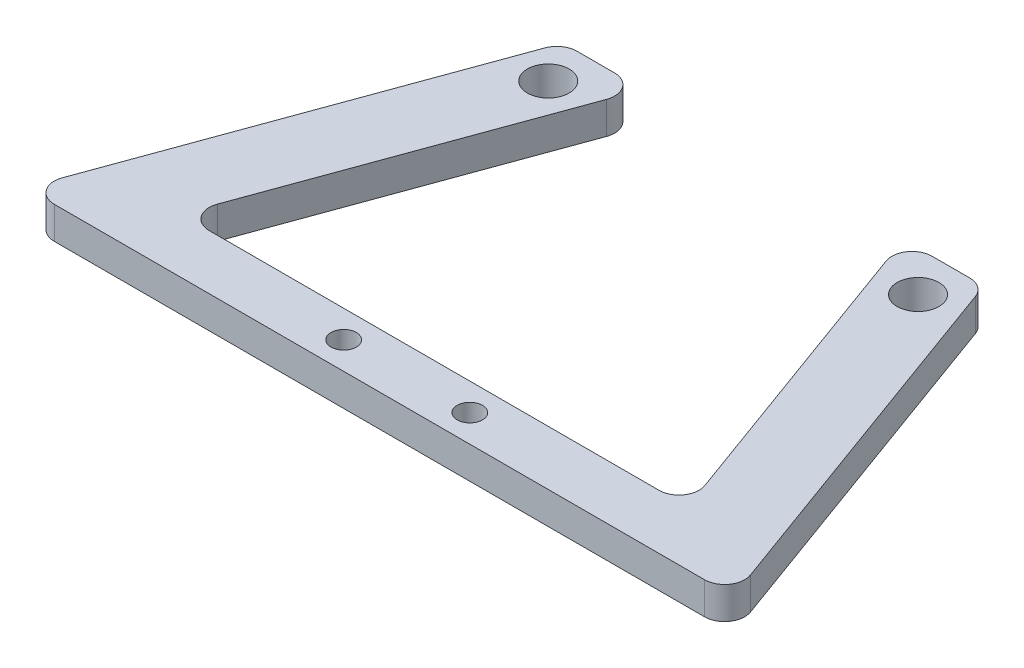
ISO-10303-21;
HEADER;
FILE_DESCRIPTION(('STEP AP214'),'2;1');
FILE_NAME('part.step','',(''),(''),'','','');
FILE_SCHEMA(('AUTOMOTIVE_DESIGN { 1 0 10303 214 1 1 1 1 }'));
ENDSEC;
DATA;
#1=APPLICATION_CONTEXT('core data for automotive mechanical design processes');
#2=APPLICATION_PROTOCOL_DEFINITION('international standard','automotive_design',2000,#1);
#3=PRODUCT_CONTEXT('',#1,'mechanical');
#4=PRODUCT('Part','Part','',(#3));
#5=PRODUCT_RELATED_PRODUCT_CATEGORY('part','',(#4));
#6=PRODUCT_DEFINITION_FORMATION('','',#4);
#7=PRODUCT_DEFINITION_CONTEXT('part definition',#1,'design');
#8=PRODUCT_DEFINITION('design','',#6,#7);
#9=PRODUCT_DEFINITION_SHAPE('','',#8);
#10=(LENGTH_UNIT() NAMED_UNIT(*) SI_UNIT(.MILLI.,.METRE.));
#11=(NAMED_UNIT(*) PLANE_ANGLE_UNIT() SI_UNIT($,.RADIAN.));
#12=(NAMED_UNIT(*) SI_UNIT($,.STERADIAN.) SOLID_ANGLE_UNIT());
#13=UNCERTAINTY_MEASURE_WITH_UNIT(LENGTH_MEASURE(1.E-05),#10,'distance_accuracy_value','');
#14=(GEOMETRIC_REPRESENTATION_CONTEXT(3) GLOBAL_UNCERTAINTY_ASSIGNED_CONTEXT((#13)) GLOBAL_UNIT_ASSIGNED_CONTEXT((#10,
#11,#12)) REPRESENTATION_CONTEXT('',''));
#15=CARTESIAN_POINT('',(0.,0.,0.));
#16=DIRECTION('',(0.,0.,1.));
#17=DIRECTION('',(1.,0.,0.));
#18=AXIS2_PLACEMENT_3D('',#15,#16,#17);
#19=CARTESIAN_POINT('',(42.3065378908995,2.54,29.5275));
#20=DIRECTION('',(0.,-1.,0.));
#21=DIRECTION('',(0.,0.,-1.));
#22=AXIS2_PLACEMENT_3D('',#19,#20,#21);
#23=PLANE('',#22);
#24=CARTESIAN_POINT('',(42.3065378908995,2.54,29.5275));
#25=DIRECTION('',(0.,1.,0.));
#26=DIRECTION('',(0.,0.,-1.));
#27=AXIS2_PLACEMENT_3D('',#24,#25,#26);
#28=CIRCLE('',#27,1.58749999999999);
#29=CARTESIAN_POINT('',(42.3065378908995,2.54,31.115));
#30=VERTEX_POINT('',#29);
#31=CARTESIAN_POINT('',(43.7982999263971,2.54,28.9845430224705));
#32=VERTEX_POINT('',#31);
#33=EDGE_CURVE('E215',#30,#32,#28,.T.);
#34=ORIENTED_EDGE('',*,*,#33,.T.);
#35=DIRECTION('',(-0.342020143325672,0.,-0.939692620785907));
#36=VECTOR('',#35,1.);
#37=CARTESIAN_POINT('',(33.6289715809993,2.54,1.04454302247049));
#38=LINE('',#37,#36);
#39=CARTESIAN_POINT('',(33.6289715809993,2.54,1.04454302247049));
#40=VERTEX_POINT('',#39);
#41=EDGE_CURVE('E123',#32,#40,#38,.T.);
#42=ORIENTED_EDGE('',*,*,#41,.T.);
#43=CARTESIAN_POINT('',(32.1372095455017,2.54,1.5875));
#44=DIRECTION('',(0.,1.,0.));
#45=DIRECTION('',(0.,0.,1.));
#46=AXIS2_PLACEMENT_3D('',#43,#44,#45);
#47=CIRCLE('',#46,1.5875);
#48=CARTESIAN_POINT('',(32.1372095455017,2.54,0.));
#49=VERTEX_POINT('',#48);
#50=EDGE_CURVE('E254',#40,#49,#47,.T.);
#51=ORIENTED_EDGE('',*,*,#50,.T.);
#52=DIRECTION('',(-1.,0.,0.));
#53=VECTOR('',#52,1.);
#54=CARTESIAN_POINT('',(29.1659739731127,2.54,0.));
#55=LINE('',#54,#53);
#56=CARTESIAN_POINT('',(29.1659739731127,2.54,0.));
#57=VERTEX_POINT('',#56);
#58=EDGE_CURVE('E273',#49,#57,#55,.T.);
#59=ORIENTED_EDGE('',*,*,#58,.T.);
#60=CARTESIAN_POINT('',(29.1659739731127,2.54,1.5875));
#61=DIRECTION('',(0.,1.,0.));
#62=DIRECTION('',(0.,0.,1.));
#63=AXIS2_PLACEMENT_3D('',#60,#61,#62);
#64=CIRCLE('',#63,1.5875);
#65=CARTESIAN_POINT('',(27.6742119376151,2.54,2.13045697752951));
#66=VERTEX_POINT('',#65);
#67=EDGE_CURVE('E270',#57,#66,#64,.T.);
#68=ORIENTED_EDGE('',*,*,#67,.T.);
#69=DIRECTION('',(0.342020143325672,0.,0.939692620785907));
#70=VECTOR('',#69,1.);
#71=CARTESIAN_POINT('',(35.8766764548356,2.54,24.6665430224705));
#72=LINE('',#71,#70);
#73=CARTESIAN_POINT('',(35.8766764548356,2.54,24.6665430224705));
#74=VERTEX_POINT('',#73);
#75=EDGE_CURVE('E272',#66,#74,#72,.T.);
#76=ORIENTED_EDGE('',*,*,#75,.T.);
#77=CARTESIAN_POINT('',(34.384914419338,2.54,25.2095));
#78=DIRECTION('',(0.,-1.,0.));
#79=DIRECTION('',(0.,0.,-1.));
#80=AXIS2_PLACEMENT_3D('',#77,#78,#79);
#81=CIRCLE('',#80,1.5875);
#82=CARTESIAN_POINT('',(34.384914419338,2.54,26.797));
#83=VERTEX_POINT('',#82);
#84=EDGE_CURVE('E275',#74,#83,#81,.T.);
#85=ORIENTED_EDGE('',*,*,#84,.T.);
#86=DIRECTION('',(-1.,0.,0.));
#87=VECTOR('',#86,1.);
#88=CARTESIAN_POINT('',(34.384914419338,2.54,26.797));
#89=LINE('',#88,#87);
#90=CARTESIAN_POINT('',(-1.13612540692842,2.54,26.797));
#91=VERTEX_POINT('',#90);
#92=EDGE_CURVE('E281',#83,#91,#89,.T.);
#93=ORIENTED_EDGE('',*,*,#92,.T.);
#94=CARTESIAN_POINT('',(-1.13612540692842,2.54,25.2095));
#95=DIRECTION('',(0.,-1.,0.));
#96=DIRECTION('',(0.,0.,-1.));
#97=AXIS2_PLACEMENT_3D('',#94,#95,#96);
#98=CIRCLE('',#97,1.5875);
#99=CARTESIAN_POINT('',(-2.62788744242605,2.54,24.6665430224705));
#100=VERTEX_POINT('',#99);
#101=EDGE_CURVE('E283',#91,#100,#98,.T.);
#102=ORIENTED_EDGE('',*,*,#101,.T.);
#103=DIRECTION('',(0.342020143325672,0.,-0.939692620785907));
#104=VECTOR('',#103,1.);
#105=CARTESIAN_POINT('',(-2.62788744242605,2.54,24.6665430224705));
#106=LINE('',#105,#104);
#107=CARTESIAN_POINT('',(5.5745770747945,2.54,2.13045697752952));
#108=VERTEX_POINT('',#107);
#109=EDGE_CURVE('E285',#100,#108,#106,.T.);
#110=ORIENTED_EDGE('',*,*,#109,.T.);
#111=CARTESIAN_POINT('',(4.08281503929688,2.54,1.5875));
#112=DIRECTION('',(0.,1.,0.));
#113=DIRECTION('',(0.,0.,1.));
#114=AXIS2_PLACEMENT_3D('',#111,#112,#113);
#115=CIRCLE('',#114,1.5875);
#116=CARTESIAN_POINT('',(4.08281503929687,2.54,0.));
#117=VERTEX_POINT('',#116);
#118=EDGE_CURVE('E287',#108,#117,#115,.T.);
#119=ORIENTED_EDGE('',*,*,#118,.T.);
#120=DIRECTION('',(-1.,0.,0.));
#121=VECTOR('',#120,1.);
#122=CARTESIAN_POINT('',(4.08281503929687,2.54,0.));
#123=LINE('',#122,#121);
#124=CARTESIAN_POINT('',(1.11157946690792,2.54,0.));
#125=VERTEX_POINT('',#124);
#126=EDGE_CURVE('E289',#117,#125,#123,.T.);
#127=ORIENTED_EDGE('',*,*,#126,.T.);
#128=CARTESIAN_POINT('',(1.11157946690791,2.54,1.5875));
#129=DIRECTION('',(0.,1.,0.));
#130=DIRECTION('',(0.,0.,-1.));
#131=AXIS2_PLACEMENT_3D('',#128,#129,#130);
#132=CIRCLE('',#131,1.5875);
#133=CARTESIAN_POINT('',(-0.38018256858972,2.54,1.0445430224705));
#134=VERTEX_POINT('',#133);
#135=EDGE_CURVE('E166',#125,#134,#132,.T.);
#136=ORIENTED_EDGE('',*,*,#135,.T.);
#137=DIRECTION('',(-0.342020143325672,0.,0.939692620785907));
#138=VECTOR('',#137,1.);
#139=CARTESIAN_POINT('',(-0.380182568589721,2.54,1.0445430224705));
#140=LINE('',#139,#138);
#141=CARTESIAN_POINT('',(-10.5495109139875,2.54,28.9845430224705));
#142=VERTEX_POINT('',#141);
#143=EDGE_CURVE('E160',#134,#142,#140,.T.);
#144=ORIENTED_EDGE('',*,*,#143,.T.);
#145=CARTESIAN_POINT('',(-9.05774887848992,2.54,29.5275));
#146=DIRECTION('',(0.,1.,0.));
#147=DIRECTION('',(0.,0.,1.));
#148=AXIS2_PLACEMENT_3D('',#145,#146,#147);
#149=CIRCLE('',#148,1.58749999999999);
#150=CARTESIAN_POINT('',(-9.05774887848992,2.54,31.115));
#151=VERTEX_POINT('',#150);
#152=EDGE_CURVE('E164',#142,#151,#149,.T.);
#153=ORIENTED_EDGE('',*,*,#152,.T.);
#154=DIRECTION('',(1.,0.,0.));
#155=VECTOR('',#154,1.);
#156=CARTESIAN_POINT('',(-9.05774887848992,2.54,31.115));
#157=LINE('',#156,#155);
#158=EDGE_CURVE('E56',#151,#30,#157,.T.);
#159=ORIENTED_EDGE('',*,*,#158,.T.);
#160=EDGE_LOOP('',(#34,#42,#51,#59,#68,#76,#85,#93,#102,#110,#119,#127,#136,#144,#153,#159));
#161=FACE_BOUND('',#160,.T.);
#162=CARTESIAN_POINT('',(2.01939450620479,2.54,3.175));
#163=DIRECTION('',(0.,1.,0.));
#164=DIRECTION('',(0.,0.,1.));
#165=AXIS2_PLACEMENT_3D('',#162,#163,#164);
#166=CIRCLE('',#165,1.65);
#167=CARTESIAN_POINT('',(2.01939450620479,2.54,4.825));
#168=VERTEX_POINT('',#167);
#169=EDGE_CURVE('E188',#168,#168,#166,.T.);
#170=ORIENTED_EDGE('',*,*,#169,.F.);
#171=EDGE_LOOP('',(#170));
#172=FACE_BOUND('',#171,.T.);
#173=CARTESIAN_POINT('',(11.6426945062048,2.54,28.956));
#174=DIRECTION('',(0.,1.,0.));
#175=DIRECTION('',(0.,0.,1.));
#176=AXIS2_PLACEMENT_3D('',#173,#174,#175);
#177=CIRCLE('',#176,1.);
#178=CARTESIAN_POINT('',(11.6426945062048,2.54,29.956));
#179=VERTEX_POINT('',#178);
#180=EDGE_CURVE('E353',#179,#179,#177,.T.);
#181=ORIENTED_EDGE('',*,*,#180,.F.);
#182=EDGE_LOOP('',(#181));
#183=FACE_BOUND('',#182,.T.);
#184=CARTESIAN_POINT('',(21.6060945062048,2.54,28.956));
#185=DIRECTION('',(0.,1.,0.));
#186=DIRECTION('',(0.,0.,-1.));
#187=AXIS2_PLACEMENT_3D('',#184,#185,#186);
#188=CIRCLE('',#187,1.);
#189=CARTESIAN_POINT('',(21.6060945062048,2.54,27.956));
#190=VERTEX_POINT('',#189);
#191=EDGE_CURVE('E347',#190,#190,#188,.T.);
#192=ORIENTED_EDGE('',*,*,#191,.F.);
#193=EDGE_LOOP('',(#192));
#194=FACE_BOUND('',#193,.T.);
#195=CARTESIAN_POINT('',(31.2293945062048,2.54,3.175));
#196=DIRECTION('',(0.,1.,0.));
#197=DIRECTION('',(0.,0.,-1.));
#198=AXIS2_PLACEMENT_3D('',#195,#196,#197);
#199=CIRCLE('',#198,1.65);
#200=CARTESIAN_POINT('',(31.2293945062048,2.54,1.525));
#201=VERTEX_POINT('',#200);
#202=EDGE_CURVE('E338',#201,#201,#199,.T.);
#203=ORIENTED_EDGE('',*,*,#202,.F.);
#204=EDGE_LOOP('',(#203));
#205=FACE_BOUND('',#204,.T.);
#206=ADVANCED_FACE('F39',(#161,#172,#183,#194,#205),#23,.F.);
#207=CARTESIAN_POINT('',(42.3065378908995,0.,29.5275));
#208=DIRECTION('',(0.,-1.,0.));
#209=DIRECTION('',(0.,0.,-1.));
#210=AXIS2_PLACEMENT_3D('',#207,#208,#209);
#211=PLANE('',#210);
#212=CARTESIAN_POINT('',(21.6060945062048,0.,28.956));
#213=DIRECTION('',(0.,1.,0.));
#214=DIRECTION('',(0.,0.,-1.));
#215=AXIS2_PLACEMENT_3D('',#212,#213,#214);
#216=CIRCLE('',#215,1.);
#217=CARTESIAN_POINT('',(21.6060945062048,0.,27.956));
#218=VERTEX_POINT('',#217);
#219=EDGE_CURVE('E344',#218,#218,#216,.T.);
#220=ORIENTED_EDGE('',*,*,#219,.T.);
#221=EDGE_LOOP('',(#220));
#222=FACE_BOUND('',#221,.T.);
#223=CARTESIAN_POINT('',(2.01939450620479,0.,3.175));
#224=DIRECTION('',(0.,1.,0.));
#225=DIRECTION('',(0.,0.,1.));
#226=AXIS2_PLACEMENT_3D('',#223,#224,#225);
#227=CIRCLE('',#226,1.65);
#228=CARTESIAN_POINT('',(2.01939450620479,0.,4.825));
#229=VERTEX_POINT('',#228);
#230=EDGE_CURVE('E356',#229,#229,#227,.T.);
#231=ORIENTED_EDGE('',*,*,#230,.T.);
#232=EDGE_LOOP('',(#231));
#233=FACE_BOUND('',#232,.T.);
#234=CARTESIAN_POINT('',(42.3065378908995,0.,29.5275));
#235=DIRECTION('',(0.,1.,0.));
#236=DIRECTION('',(0.,0.,-1.));
#237=AXIS2_PLACEMENT_3D('',#234,#235,#236);
#238=CIRCLE('',#237,1.58749999999999);
#239=CARTESIAN_POINT('',(42.3065378908995,0.,31.115));
#240=VERTEX_POINT('',#239);
#241=CARTESIAN_POINT('',(43.7982999263971,0.,28.9845430224705));
#242=VERTEX_POINT('',#241);
#243=EDGE_CURVE('E184',#240,#242,#238,.T.);
#244=ORIENTED_EDGE('',*,*,#243,.F.);
#245=DIRECTION('',(1.,0.,0.));
#246=VECTOR('',#245,1.);
#247=CARTESIAN_POINT('',(-9.05774887848992,0.,31.115));
#248=LINE('',#247,#246);
#249=CARTESIAN_POINT('',(-9.05774887848992,0.,31.115));
#250=VERTEX_POINT('',#249);
#251=EDGE_CURVE('E115',#250,#240,#248,.T.);
#252=ORIENTED_EDGE('',*,*,#251,.F.);
#253=CARTESIAN_POINT('',(-9.05774887848992,0.,29.5275));
#254=DIRECTION('',(0.,1.,0.));
#255=DIRECTION('',(0.,0.,1.));
#256=AXIS2_PLACEMENT_3D('',#253,#254,#255);
#257=CIRCLE('',#256,1.58749999999999);
#258=CARTESIAN_POINT('',(-10.5495109139875,0.,28.9845430224705));
#259=VERTEX_POINT('',#258);
#260=EDGE_CURVE('E109',#259,#250,#257,.T.);
#261=ORIENTED_EDGE('',*,*,#260,.F.);
#262=DIRECTION('',(-0.342020143325672,0.,0.939692620785907));
#263=VECTOR('',#262,1.);
#264=CARTESIAN_POINT('',(-0.380182568589721,0.,1.0445430224705));
#265=LINE('',#264,#263);
#266=CARTESIAN_POINT('',(-0.38018256858972,0.,1.0445430224705));
#267=VERTEX_POINT('',#266);
#268=EDGE_CURVE('E174',#267,#259,#265,.T.);
#269=ORIENTED_EDGE('',*,*,#268,.F.);
#270=CARTESIAN_POINT('',(1.11157946690791,0.,1.5875));
#271=DIRECTION('',(0.,1.,0.));
#272=DIRECTION('',(0.,0.,-1.));
#273=AXIS2_PLACEMENT_3D('',#270,#271,#272);
#274=CIRCLE('',#273,1.5875);
#275=CARTESIAN_POINT('',(1.11157946690792,0.,0.));
#276=VERTEX_POINT('',#275);
#277=EDGE_CURVE('E210',#276,#267,#274,.T.);
#278=ORIENTED_EDGE('',*,*,#277,.F.);
#279=DIRECTION('',(-1.,0.,0.));
#280=VECTOR('',#279,1.);
#281=CARTESIAN_POINT('',(4.08281503929687,0.,0.));
#282=LINE('',#281,#280);
#283=CARTESIAN_POINT('',(4.08281503929687,0.,0.));
#284=VERTEX_POINT('',#283);
#285=EDGE_CURVE('E208',#284,#276,#282,.T.);
#286=ORIENTED_EDGE('',*,*,#285,.F.);
#287=CARTESIAN_POINT('',(4.08281503929688,0.,1.5875));
#288=DIRECTION('',(0.,1.,0.));
#289=DIRECTION('',(0.,0.,1.));
#290=AXIS2_PLACEMENT_3D('',#287,#288,#289);
#291=CIRCLE('',#290,1.5875);
#292=CARTESIAN_POINT('',(5.5745770747945,0.,2.13045697752952));
#293=VERTEX_POINT('',#292);
#294=EDGE_CURVE('E206',#293,#284,#291,.T.);
#295=ORIENTED_EDGE('',*,*,#294,.F.);
#296=DIRECTION('',(0.342020143325672,0.,-0.939692620785907));
#297=VECTOR('',#296,1.);
#298=CARTESIAN_POINT('',(-2.62788744242605,0.,24.6665430224705));
#299=LINE('',#298,#297);
#300=CARTESIAN_POINT('',(-2.62788744242605,0.,24.6665430224705));
#301=VERTEX_POINT('',#300);
#302=EDGE_CURVE('E204',#301,#293,#299,.T.);
#303=ORIENTED_EDGE('',*,*,#302,.F.);
#304=CARTESIAN_POINT('',(-1.13612540692842,0.,25.2095));
#305=DIRECTION('',(0.,-1.,0.));
#306=DIRECTION('',(0.,0.,-1.));
#307=AXIS2_PLACEMENT_3D('',#304,#305,#306);
#308=CIRCLE('',#307,1.5875);
#309=CARTESIAN_POINT('',(-1.13612540692842,0.,26.797));
#310=VERTEX_POINT('',#309);
#311=EDGE_CURVE('E202',#310,#301,#308,.T.);
#312=ORIENTED_EDGE('',*,*,#311,.F.);
#313=DIRECTION('',(-1.,0.,0.));
#314=VECTOR('',#313,1.);
#315=CARTESIAN_POINT('',(34.384914419338,0.,26.797));
#316=LINE('',#315,#314);
#317=CARTESIAN_POINT('',(34.384914419338,0.,26.797));
#318=VERTEX_POINT('',#317);
#319=EDGE_CURVE('E200',#318,#310,#316,.T.);
#320=ORIENTED_EDGE('',*,*,#319,.F.);
#321=CARTESIAN_POINT('',(34.384914419338,0.,25.2095));
#322=DIRECTION('',(0.,-1.,0.));
#323=DIRECTION('',(0.,0.,-1.));
#324=AXIS2_PLACEMENT_3D('',#321,#322,#323);
#325=CIRCLE('',#324,1.5875);
#326=CARTESIAN_POINT('',(35.8766764548356,0.,24.6665430224705));
#327=VERTEX_POINT('',#326);
#328=EDGE_CURVE('E198',#327,#318,#325,.T.);
#329=ORIENTED_EDGE('',*,*,#328,.F.);
#330=DIRECTION('',(0.342020143325672,0.,0.939692620785907));
#331=VECTOR('',#330,1.);
#332=CARTESIAN_POINT('',(35.8766764548356,0.,24.6665430224705));
#333=LINE('',#332,#331);
#334=CARTESIAN_POINT('',(27.6742119376151,0.,2.13045697752951));
#335=VERTEX_POINT('',#334);
#336=EDGE_CURVE('E196',#335,#327,#333,.T.);
#337=ORIENTED_EDGE('',*,*,#336,.F.);
#338=CARTESIAN_POINT('',(29.1659739731127,0.,1.5875));
#339=DIRECTION('',(0.,1.,0.));
#340=DIRECTION('',(0.,0.,1.));
#341=AXIS2_PLACEMENT_3D('',#338,#339,#340);
#342=CIRCLE('',#341,1.5875);
#343=CARTESIAN_POINT('',(29.1659739731127,0.,0.));
#344=VERTEX_POINT('',#343);
#345=EDGE_CURVE('E194',#344,#335,#342,.T.);
#346=ORIENTED_EDGE('',*,*,#345,.F.);
#347=DIRECTION('',(-1.,0.,0.));
#348=VECTOR('',#347,1.);
#349=CARTESIAN_POINT('',(29.1659739731127,0.,0.));
#350=LINE('',#349,#348);
#351=CARTESIAN_POINT('',(32.1372095455017,0.,0.));
#352=VERTEX_POINT('',#351);
#353=EDGE_CURVE('E192',#352,#344,#350,.T.);
#354=ORIENTED_EDGE('',*,*,#353,.F.);
#355=CARTESIAN_POINT('',(32.1372095455017,0.,1.5875));
#356=DIRECTION('',(0.,1.,0.));
#357=DIRECTION('',(0.,0.,1.));
#358=AXIS2_PLACEMENT_3D('',#355,#356,#357);
#359=CIRCLE('',#358,1.5875);
#360=CARTESIAN_POINT('',(33.6289715809993,0.,1.04454302247049));
#361=VERTEX_POINT('',#360);
#362=EDGE_CURVE('E190',#361,#352,#359,.T.);
#363=ORIENTED_EDGE('',*,*,#362,.F.);
#364=DIRECTION('',(-0.342020143325672,0.,-0.939692620785907));
#365=VECTOR('',#364,1.);
#366=CARTESIAN_POINT('',(33.6289715809993,0.,1.04454302247049));
#367=LINE('',#366,#365);
#368=EDGE_CURVE('E187',#242,#361,#367,.T.);
#369=ORIENTED_EDGE('',*,*,#368,.F.);
#370=EDGE_LOOP('',(#244,#252,#261,#269,#278,#286,#295,#303,#312,#320,#329,#337,#346,#354,#363,#369));
#371=FACE_BOUND('',#370,.T.);
#372=CARTESIAN_POINT('',(11.6426945062048,0.,28.956));
#373=DIRECTION('',(0.,1.,0.));
#374=DIRECTION('',(0.,0.,1.));
#375=AXIS2_PLACEMENT_3D('',#372,#373,#374);
#376=CIRCLE('',#375,1.);
#377=CARTESIAN_POINT('',(11.6426945062048,0.,29.956));
#378=VERTEX_POINT('',#377);
#379=EDGE_CURVE('E350',#378,#378,#376,.T.);
#380=ORIENTED_EDGE('',*,*,#379,.T.);
#381=EDGE_LOOP('',(#380));
#382=FACE_BOUND('',#381,.T.);
#383=CARTESIAN_POINT('',(31.2293945062048,0.,3.175));
#384=DIRECTION('',(0.,1.,0.));
#385=DIRECTION('',(0.,0.,-1.));
#386=AXIS2_PLACEMENT_3D('',#383,#384,#385);
#387=CIRCLE('',#386,1.65);
#388=CARTESIAN_POINT('',(31.2293945062048,0.,1.525));
#389=VERTEX_POINT('',#388);
#390=EDGE_CURVE('E341',#389,#389,#387,.T.);
#391=ORIENTED_EDGE('',*,*,#390,.T.);
#392=EDGE_LOOP('',(#391));
#393=FACE_BOUND('',#392,.T.);
#394=ADVANCED_FACE('F258',(#222,#233,#371,#382,#393),#211,.T.);
#395=CARTESIAN_POINT('',(42.3065378908995,2.54,29.5275));
#396=DIRECTION('',(0.,-1.,0.));
#397=DIRECTION('',(0.,0.,-1.));
#398=AXIS2_PLACEMENT_3D('',#395,#396,#397);
#399=CYLINDRICAL_SURFACE('',#398,1.58749999999999);
#400=ORIENTED_EDGE('',*,*,#243,.T.);
#401=DIRECTION('',(0.,-1.,0.));
#402=VECTOR('',#401,1.);
#403=CARTESIAN_POINT('',(43.7982999263971,2.54,28.9845430224705));
#404=LINE('',#403,#402);
#405=EDGE_CURVE('E11',#32,#242,#404,.T.);
#406=ORIENTED_EDGE('',*,*,#405,.F.);
#407=ORIENTED_EDGE('',*,*,#33,.F.);
#408=DIRECTION('',(0.,-1.,0.));
#409=VECTOR('',#408,1.);
#410=CARTESIAN_POINT('',(42.3065378908995,2.54,31.115));
#411=LINE('',#410,#409);
#412=EDGE_CURVE('E180',#30,#240,#411,.T.);
#413=ORIENTED_EDGE('',*,*,#412,.T.);
#414=EDGE_LOOP('',(#400,#406,#407,#413));
#415=FACE_BOUND('',#414,.T.);
#416=ADVANCED_FACE('F41',(#415),#399,.T.);
#417=CARTESIAN_POINT('',(33.6289715809993,2.54,1.04454302247049));
#418=DIRECTION('',(-0.939692620785907,0.,0.342020143325672));
#419=DIRECTION('',(0.342020143325673,0.,0.939692620785907));
#420=AXIS2_PLACEMENT_3D('',#417,#418,#419);
#421=PLANE('',#420);
#422=ORIENTED_EDGE('',*,*,#368,.T.);
#423=DIRECTION('',(0.,-1.,0.));
#424=VECTOR('',#423,1.);
#425=CARTESIAN_POINT('',(33.6289715809993,2.54,1.04454302247049));
#426=LINE('',#425,#424);
#427=EDGE_CURVE('E48',#40,#361,#426,.T.);
#428=ORIENTED_EDGE('',*,*,#427,.F.);
#429=ORIENTED_EDGE('',*,*,#41,.F.);
#430=ORIENTED_EDGE('',*,*,#405,.T.);
#431=EDGE_LOOP('',(#422,#428,#429,#430));
#432=FACE_BOUND('',#431,.T.);
#433=ADVANCED_FACE('F512',(#432),#421,.F.);
#434=CARTESIAN_POINT('',(32.1372095455017,2.54,1.5875));
#435=DIRECTION('',(0.,-1.,0.));
#436=DIRECTION('',(0.,0.,-1.));
#437=AXIS2_PLACEMENT_3D('',#434,#435,#436);
#438=CYLINDRICAL_SURFACE('',#437,1.5875);
#439=ORIENTED_EDGE('',*,*,#362,.T.);
#440=DIRECTION('',(0.,-1.,0.));
#441=VECTOR('',#440,1.);
#442=CARTESIAN_POINT('',(32.1372095455017,2.54,0.));
#443=LINE('',#442,#441);
#444=EDGE_CURVE('E246',#49,#352,#443,.T.);
#445=ORIENTED_EDGE('',*,*,#444,.F.);
#446=ORIENTED_EDGE('',*,*,#50,.F.);
#447=ORIENTED_EDGE('',*,*,#427,.T.);
#448=EDGE_LOOP('',(#439,#445,#446,#447));
#449=FACE_BOUND('',#448,.T.);
#450=ADVANCED_FACE('F252',(#449),#438,.T.);
#451=CARTESIAN_POINT('',(29.1659739731127,2.54,0.));
#452=DIRECTION('',(0.,0.,1.));
#453=DIRECTION('',(1.,0.,0.));
#454=AXIS2_PLACEMENT_3D('',#451,#452,#453);
#455=PLANE('',#454);
#456=ORIENTED_EDGE('',*,*,#353,.T.);
#457=DIRECTION('',(0.,-1.,0.));
#458=VECTOR('',#457,1.);
#459=CARTESIAN_POINT('',(29.1659739731127,2.54,0.));
#460=LINE('',#459,#458);
#461=EDGE_CURVE('E243',#57,#344,#460,.T.);
#462=ORIENTED_EDGE('',*,*,#461,.F.);
#463=ORIENTED_EDGE('',*,*,#58,.F.);
#464=ORIENTED_EDGE('',*,*,#444,.T.);
#465=EDGE_LOOP('',(#456,#462,#463,#464));
#466=FACE_BOUND('',#465,.T.);
#467=ADVANCED_FACE('F264',(#466),#455,.F.);
#468=CARTESIAN_POINT('',(29.1659739731127,2.54,1.5875));
#469=DIRECTION('',(0.,-1.,0.));
#470=DIRECTION('',(0.,0.,-1.));
#471=AXIS2_PLACEMENT_3D('',#468,#469,#470);
#472=CYLINDRICAL_SURFACE('',#471,1.5875);
#473=ORIENTED_EDGE('',*,*,#345,.T.);
#474=DIRECTION('',(0.,-1.,0.));
#475=VECTOR('',#474,1.);
#476=CARTESIAN_POINT('',(27.6742119376151,2.54,2.13045697752951));
#477=LINE('',#476,#475);
#478=EDGE_CURVE('E240',#66,#335,#477,.T.);
#479=ORIENTED_EDGE('',*,*,#478,.F.);
#480=ORIENTED_EDGE('',*,*,#67,.F.);
#481=ORIENTED_EDGE('',*,*,#461,.T.);
#482=EDGE_LOOP('',(#473,#479,#480,#481));
#483=FACE_BOUND('',#482,.T.);
#484=ADVANCED_FACE('F268',(#483),#472,.T.);
#485=CARTESIAN_POINT('',(35.8766764548356,2.54,24.6665430224705));
#486=DIRECTION('',(0.939692620785907,0.,-0.342020143325672));
#487=DIRECTION('',(-0.342020143325672,0.,-0.939692620785907));
#488=AXIS2_PLACEMENT_3D('',#485,#486,#487);
#489=PLANE('',#488);
#490=ORIENTED_EDGE('',*,*,#336,.T.);
#491=DIRECTION('',(0.,-1.,0.));
#492=VECTOR('',#491,1.);
#493=CARTESIAN_POINT('',(35.8766764548356,2.54,24.6665430224705));
#494=LINE('',#493,#492);
#495=EDGE_CURVE('E237',#74,#327,#494,.T.);
#496=ORIENTED_EDGE('',*,*,#495,.F.);
#497=ORIENTED_EDGE('',*,*,#75,.F.);
#498=ORIENTED_EDGE('',*,*,#478,.T.);
#499=EDGE_LOOP('',(#490,#496,#497,#498));
#500=FACE_BOUND('',#499,.T.);
#501=ADVANCED_FACE('F477',(#500),#489,.F.);
#502=CARTESIAN_POINT('',(34.384914419338,2.54,25.2095));
#503=DIRECTION('',(0.,-1.,0.));
#504=DIRECTION('',(0.,0.,-1.));
#505=AXIS2_PLACEMENT_3D('',#502,#503,#504);
#506=CYLINDRICAL_SURFACE('',#505,1.5875);
#507=ORIENTED_EDGE('',*,*,#328,.T.);
#508=DIRECTION('',(0.,-1.,0.));
#509=VECTOR('',#508,1.);
#510=CARTESIAN_POINT('',(34.384914419338,2.54,26.797));
#511=LINE('',#510,#509);
#512=EDGE_CURVE('E234',#83,#318,#511,.T.);
#513=ORIENTED_EDGE('',*,*,#512,.F.);
#514=ORIENTED_EDGE('',*,*,#84,.F.);
#515=ORIENTED_EDGE('',*,*,#495,.T.);
#516=EDGE_LOOP('',(#507,#513,#514,#515));
#517=FACE_BOUND('',#516,.T.);
#518=ADVANCED_FACE('F467',(#517),#506,.F.);
#519=CARTESIAN_POINT('',(34.384914419338,2.54,26.797));
#520=DIRECTION('',(0.,0.,1.));
#521=DIRECTION('',(1.,0.,0.));
#522=AXIS2_PLACEMENT_3D('',#519,#520,#521);
#523=PLANE('',#522);
#524=ORIENTED_EDGE('',*,*,#319,.T.);
#525=DIRECTION('',(0.,-1.,0.));
#526=VECTOR('',#525,1.);
#527=CARTESIAN_POINT('',(-1.13612540692842,2.54,26.797));
#528=LINE('',#527,#526);
#529=EDGE_CURVE('E231',#91,#310,#528,.T.);
#530=ORIENTED_EDGE('',*,*,#529,.F.);
#531=ORIENTED_EDGE('',*,*,#92,.F.);
#532=ORIENTED_EDGE('',*,*,#512,.T.);
#533=EDGE_LOOP('',(#524,#530,#531,#532));
#534=FACE_BOUND('',#533,.T.);
#535=ADVANCED_FACE('F457',(#534),#523,.F.);
#536=CARTESIAN_POINT('',(-1.13612540692842,2.54,25.2095));
#537=DIRECTION('',(0.,-1.,0.));
#538=DIRECTION('',(0.,0.,-1.));
#539=AXIS2_PLACEMENT_3D('',#536,#537,#538);
#540=CYLINDRICAL_SURFACE('',#539,1.5875);
#541=ORIENTED_EDGE('',*,*,#311,.T.);
#542=DIRECTION('',(0.,-1.,0.));
#543=VECTOR('',#542,1.);
#544=CARTESIAN_POINT('',(-2.62788744242605,2.54,24.6665430224705));
#545=LINE('',#544,#543);
#546=EDGE_CURVE('E228',#100,#301,#545,.T.);
#547=ORIENTED_EDGE('',*,*,#546,.F.);
#548=ORIENTED_EDGE('',*,*,#101,.F.);
#549=ORIENTED_EDGE('',*,*,#529,.T.);
#550=EDGE_LOOP('',(#541,#547,#548,#549));
#551=FACE_BOUND('',#550,.T.);
#552=ADVANCED_FACE('F447',(#551),#540,.F.);
#553=CARTESIAN_POINT('',(-2.62788744242605,2.54,24.6665430224705));
#554=DIRECTION('',(-0.939692620785907,0.,-0.342020143325672));
#555=DIRECTION('',(-0.342020143325672,0.,0.939692620785907));
#556=AXIS2_PLACEMENT_3D('',#553,#554,#555);
#557=PLANE('',#556);
#558=ORIENTED_EDGE('',*,*,#302,.T.);
#559=DIRECTION('',(0.,-1.,0.));
#560=VECTOR('',#559,1.);
#561=CARTESIAN_POINT('',(5.5745770747945,2.54,2.13045697752952));
#562=LINE('',#561,#560);
#563=EDGE_CURVE('E225',#108,#293,#562,.T.);
#564=ORIENTED_EDGE('',*,*,#563,.F.);
#565=ORIENTED_EDGE('',*,*,#109,.F.);
#566=ORIENTED_EDGE('',*,*,#546,.T.);
#567=EDGE_LOOP('',(#558,#564,#565,#566));
#568=FACE_BOUND('',#567,.T.);
#569=ADVANCED_FACE('F437',(#568),#557,.F.);
#570=CARTESIAN_POINT('',(4.08281503929688,2.54,1.5875));
#571=DIRECTION('',(0.,-1.,0.));
#572=DIRECTION('',(0.,0.,-1.));
#573=AXIS2_PLACEMENT_3D('',#570,#571,#572);
#574=CYLINDRICAL_SURFACE('',#573,1.5875);
#575=ORIENTED_EDGE('',*,*,#294,.T.);
#576=DIRECTION('',(0.,-1.,0.));
#577=VECTOR('',#576,1.);
#578=CARTESIAN_POINT('',(4.08281503929687,2.54,0.));
#579=LINE('',#578,#577);
#580=EDGE_CURVE('E222',#117,#284,#579,.T.);
#581=ORIENTED_EDGE('',*,*,#580,.F.);
#582=ORIENTED_EDGE('',*,*,#118,.F.);
#583=ORIENTED_EDGE('',*,*,#563,.T.);
#584=EDGE_LOOP('',(#575,#581,#582,#583));
#585=FACE_BOUND('',#584,.T.);
#586=ADVANCED_FACE('F428',(#585),#574,.T.);
#587=CARTESIAN_POINT('',(4.08281503929687,2.54,0.));
#588=DIRECTION('',(0.,0.,1.));
#589=DIRECTION('',(1.,0.,0.));
#590=AXIS2_PLACEMENT_3D('',#587,#588,#589);
#591=PLANE('',#590);
#592=ORIENTED_EDGE('',*,*,#285,.T.);
#593=DIRECTION('',(0.,-1.,0.));
#594=VECTOR('',#593,1.);
#595=CARTESIAN_POINT('',(1.11157946690792,2.54,0.));
#596=LINE('',#595,#594);
#597=EDGE_CURVE('E219',#125,#276,#596,.T.);
#598=ORIENTED_EDGE('',*,*,#597,.F.);
#599=ORIENTED_EDGE('',*,*,#126,.F.);
#600=ORIENTED_EDGE('',*,*,#580,.T.);
#601=EDGE_LOOP('',(#592,#598,#599,#600));
#602=FACE_BOUND('',#601,.T.);
#603=ADVANCED_FACE('F295',(#602),#591,.F.);
#604=CARTESIAN_POINT('',(1.11157946690791,2.54,1.5875));
#605=DIRECTION('',(0.,-1.,0.));
#606=DIRECTION('',(0.,0.,-1.));
#607=AXIS2_PLACEMENT_3D('',#604,#605,#606);
#608=CYLINDRICAL_SURFACE('',#607,1.5875);
#609=ORIENTED_EDGE('',*,*,#277,.T.);
#610=DIRECTION('',(0.,-1.,0.));
#611=VECTOR('',#610,1.);
#612=CARTESIAN_POINT('',(-0.38018256858972,2.54,1.0445430224705));
#613=LINE('',#612,#611);
#614=EDGE_CURVE('E175',#134,#267,#613,.T.);
#615=ORIENTED_EDGE('',*,*,#614,.F.);
#616=ORIENTED_EDGE('',*,*,#135,.F.);
#617=ORIENTED_EDGE('',*,*,#597,.T.);
#618=EDGE_LOOP('',(#609,#615,#616,#617));
#619=FACE_BOUND('',#618,.T.);
#620=ADVANCED_FACE('F299',(#619),#608,.T.);
#621=CARTESIAN_POINT('',(-0.380182568589721,2.54,1.0445430224705));
#622=DIRECTION('',(0.939692620785907,0.,0.342020143325672));
#623=DIRECTION('',(0.342020143325672,0.,-0.939692620785907));
#624=AXIS2_PLACEMENT_3D('',#621,#622,#623);
#625=PLANE('',#624);
#626=ORIENTED_EDGE('',*,*,#268,.T.);
#627=DIRECTION('',(0.,-1.,0.));
#628=VECTOR('',#627,1.);
#629=CARTESIAN_POINT('',(-10.5495109139875,2.54,28.9845430224705));
#630=LINE('',#629,#628);
#631=EDGE_CURVE('E171',#142,#259,#630,.T.);
#632=ORIENTED_EDGE('',*,*,#631,.F.);
#633=ORIENTED_EDGE('',*,*,#143,.F.);
#634=ORIENTED_EDGE('',*,*,#614,.T.);
#635=EDGE_LOOP('',(#626,#632,#633,#634));
#636=FACE_BOUND('',#635,.T.);
#637=ADVANCED_FACE('F172',(#636),#625,.F.);
#638=CARTESIAN_POINT('',(-9.05774887848992,2.54,29.5275));
#639=DIRECTION('',(0.,-1.,0.));
#640=DIRECTION('',(0.,0.,-1.));
#641=AXIS2_PLACEMENT_3D('',#638,#639,#640);
#642=CYLINDRICAL_SURFACE('',#641,1.58749999999999);
#643=ORIENTED_EDGE('',*,*,#260,.T.);
#644=DIRECTION('',(0.,-1.,0.));
#645=VECTOR('',#644,1.);
#646=CARTESIAN_POINT('',(-9.05774887848992,2.54,31.115));
#647=LINE('',#646,#645);
#648=EDGE_CURVE('E176',#151,#250,#647,.T.);
#649=ORIENTED_EDGE('',*,*,#648,.F.);
#650=ORIENTED_EDGE('',*,*,#152,.F.);
#651=ORIENTED_EDGE('',*,*,#631,.T.);
#652=EDGE_LOOP('',(#643,#649,#650,#651));
#653=FACE_BOUND('',#652,.T.);
#654=ADVANCED_FACE('F178',(#653),#642,.T.);
#655=CARTESIAN_POINT('',(-9.05774887848992,2.54,31.115));
#656=DIRECTION('',(0.,0.,-1.));
#657=DIRECTION('',(-1.,0.,0.));
#658=AXIS2_PLACEMENT_3D('',#655,#656,#657);
#659=PLANE('',#658);
#660=ORIENTED_EDGE('',*,*,#251,.T.);
#661=ORIENTED_EDGE('',*,*,#412,.F.);
#662=ORIENTED_EDGE('',*,*,#158,.F.);
#663=ORIENTED_EDGE('',*,*,#648,.T.);
#664=EDGE_LOOP('',(#660,#661,#662,#663));
#665=FACE_BOUND('',#664,.T.);
#666=ADVANCED_FACE('F303',(#665),#659,.F.);
#667=CARTESIAN_POINT('',(2.01939450620479,2.54,3.175));
#668=DIRECTION('',(0.,-1.,0.));
#669=DIRECTION('',(0.,0.,-1.));
#670=AXIS2_PLACEMENT_3D('',#667,#668,#669);
#671=CYLINDRICAL_SURFACE('',#670,1.65);
#672=ORIENTED_EDGE('',*,*,#169,.T.);
#673=EDGE_LOOP('',(#672));
#674=FACE_BOUND('',#673,.T.);
#675=ORIENTED_EDGE('',*,*,#230,.F.);
#676=EDGE_LOOP('',(#675));
#677=FACE_BOUND('',#676,.T.);
#678=ADVANCED_FACE('F305',(#674,#677),#671,.F.);
#679=CARTESIAN_POINT('',(11.6426945062048,2.54,28.956));
#680=DIRECTION('',(0.,-1.,0.));
#681=DIRECTION('',(0.,0.,-1.));
#682=AXIS2_PLACEMENT_3D('',#679,#680,#681);
#683=CYLINDRICAL_SURFACE('',#682,1.);
#684=ORIENTED_EDGE('',*,*,#180,.T.);
#685=EDGE_LOOP('',(#684));
#686=FACE_BOUND('',#685,.T.);
#687=ORIENTED_EDGE('',*,*,#379,.F.);
#688=EDGE_LOOP('',(#687));
#689=FACE_BOUND('',#688,.T.);
#690=ADVANCED_FACE('F311',(#686,#689),#683,.F.);
#691=CARTESIAN_POINT('',(21.6060945062048,2.54,28.956));
#692=DIRECTION('',(0.,-1.,0.));
#693=DIRECTION('',(0.,0.,-1.));
#694=AXIS2_PLACEMENT_3D('',#691,#692,#693);
#695=CYLINDRICAL_SURFACE('',#694,1.);
#696=ORIENTED_EDGE('',*,*,#191,.T.);
#697=EDGE_LOOP('',(#696));
#698=FACE_BOUND('',#697,.T.);
#699=ORIENTED_EDGE('',*,*,#219,.F.);
#700=EDGE_LOOP('',(#699));
#701=FACE_BOUND('',#700,.T.);
#702=ADVANCED_FACE('F325',(#698,#701),#695,.F.);
#703=CARTESIAN_POINT('',(31.2293945062048,2.54,3.175));
#704=DIRECTION('',(0.,-1.,0.));
#705=DIRECTION('',(0.,0.,-1.));
#706=AXIS2_PLACEMENT_3D('',#703,#704,#705);
#707=CYLINDRICAL_SURFACE('',#706,1.65);
#708=ORIENTED_EDGE('',*,*,#202,.T.);
#709=EDGE_LOOP('',(#708));
#710=FACE_BOUND('',#709,.T.);
#711=ORIENTED_EDGE('',*,*,#390,.F.);
#712=EDGE_LOOP('',(#711));
#713=FACE_BOUND('',#712,.T.);
#714=ADVANCED_FACE('F329',(#710,#713),#707,.F.);
#715=CLOSED_SHELL('',(#206,#394,#416,#433,#450,#467,#484,#501,#518,#535,#552,#569,#586,#603,
#620,#637,#654,#666,#678,#690,#702,#714));
#716=MANIFOLD_SOLID_BREP('B2',#715);
#717=ADVANCED_BREP_SHAPE_REPRESENTATION('',(#18,#716),#14);
#718=SHAPE_DEFINITION_REPRESENTATION(#9,#717);
ENDSEC;
END-ISO-10303-21;
